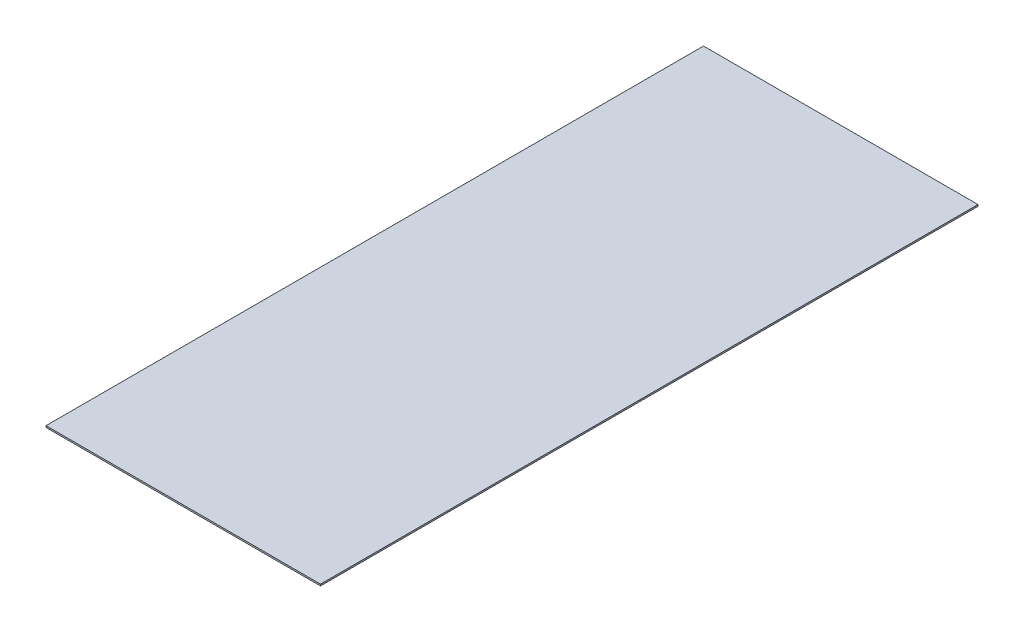
ISO-10303-21;
HEADER;
FILE_DESCRIPTION(('STEP AP214'),'2;1');
FILE_NAME('part.step','',(''),(''),'','','');
FILE_SCHEMA(('AUTOMOTIVE_DESIGN { 1 0 10303 214 1 1 1 1 }'));
ENDSEC;
DATA;
#1=APPLICATION_CONTEXT('core data for automotive mechanical design processes');
#2=APPLICATION_PROTOCOL_DEFINITION('international standard','automotive_design',2000,#1);
#3=PRODUCT_CONTEXT('',#1,'mechanical');
#4=PRODUCT('Part','Part','',(#3));
#5=PRODUCT_RELATED_PRODUCT_CATEGORY('part','',(#4));
#6=PRODUCT_DEFINITION_FORMATION('','',#4);
#7=PRODUCT_DEFINITION_CONTEXT('part definition',#1,'design');
#8=PRODUCT_DEFINITION('design','',#6,#7);
#9=PRODUCT_DEFINITION_SHAPE('','',#8);
#10=(LENGTH_UNIT() NAMED_UNIT(*) SI_UNIT(.MILLI.,.METRE.));
#11=(NAMED_UNIT(*) PLANE_ANGLE_UNIT() SI_UNIT($,.RADIAN.));
#12=(NAMED_UNIT(*) SI_UNIT($,.STERADIAN.) SOLID_ANGLE_UNIT());
#13=UNCERTAINTY_MEASURE_WITH_UNIT(LENGTH_MEASURE(1.E-05),#10,'distance_accuracy_value','');
#14=(GEOMETRIC_REPRESENTATION_CONTEXT(3) GLOBAL_UNCERTAINTY_ASSIGNED_CONTEXT((#13)) GLOBAL_UNIT_ASSIGNED_CONTEXT((#10,
#11,#12)) REPRESENTATION_CONTEXT('',''));
#15=CARTESIAN_POINT('',(0.,0.,0.));
#16=DIRECTION('',(0.,0.,1.));
#17=DIRECTION('',(1.,0.,0.));
#18=AXIS2_PLACEMENT_3D('',#15,#16,#17);
#19=CARTESIAN_POINT('',(546.1,6.35,1308.1));
#20=DIRECTION('',(-1.,0.,0.));
#21=DIRECTION('',(0.,0.,1.));
#22=AXIS2_PLACEMENT_3D('',#19,#20,#21);
#23=PLANE('',#22);
#24=DIRECTION('',(0.,0.,-1.));
#25=VECTOR('',#24,1.);
#26=CARTESIAN_POINT('',(546.1,0.,1308.1));
#27=LINE('',#26,#25);
#28=CARTESIAN_POINT('',(546.1,0.,1308.1));
#29=VERTEX_POINT('',#28);
#30=CARTESIAN_POINT('',(546.1,0.,-1308.1));
#31=VERTEX_POINT('',#30);
#32=EDGE_CURVE('E96',#29,#31,#27,.T.);
#33=ORIENTED_EDGE('',*,*,#32,.T.);
#34=DIRECTION('',(0.,-1.,0.));
#35=VECTOR('',#34,1.);
#36=CARTESIAN_POINT('',(546.1,6.35,-1308.1));
#37=LINE('',#36,#35);
#38=CARTESIAN_POINT('',(546.1,6.35,-1308.1));
#39=VERTEX_POINT('',#38);
#40=EDGE_CURVE('E11',#39,#31,#37,.T.);
#41=ORIENTED_EDGE('',*,*,#40,.F.);
#42=DIRECTION('',(0.,0.,-1.));
#43=VECTOR('',#42,1.);
#44=CARTESIAN_POINT('',(546.1,6.35,1308.1));
#45=LINE('',#44,#43);
#46=CARTESIAN_POINT('',(546.1,6.35,1308.1));
#47=VERTEX_POINT('',#46);
#48=EDGE_CURVE('E84',#47,#39,#45,.T.);
#49=ORIENTED_EDGE('',*,*,#48,.F.);
#50=DIRECTION('',(0.,-1.,0.));
#51=VECTOR('',#50,1.);
#52=CARTESIAN_POINT('',(546.1,6.35,1308.1));
#53=LINE('',#52,#51);
#54=EDGE_CURVE('E92',#47,#29,#53,.T.);
#55=ORIENTED_EDGE('',*,*,#54,.T.);
#56=EDGE_LOOP('',(#33,#41,#49,#55));
#57=FACE_BOUND('',#56,.T.);
#58=ADVANCED_FACE('F33',(#57),#23,.F.);
#59=CARTESIAN_POINT('',(-546.1,6.35,-1308.1));
#60=DIRECTION('',(0.,0.,1.));
#61=DIRECTION('',(1.,0.,0.));
#62=AXIS2_PLACEMENT_3D('',#59,#60,#61);
#63=PLANE('',#62);
#64=DIRECTION('',(-1.,0.,0.));
#65=VECTOR('',#64,1.);
#66=CARTESIAN_POINT('',(-546.1,0.,-1308.1));
#67=LINE('',#66,#65);
#68=CARTESIAN_POINT('',(-546.1,0.,-1308.1));
#69=VERTEX_POINT('',#68);
#70=EDGE_CURVE('E88',#31,#69,#67,.T.);
#71=ORIENTED_EDGE('',*,*,#70,.T.);
#72=DIRECTION('',(0.,-1.,0.));
#73=VECTOR('',#72,1.);
#74=CARTESIAN_POINT('',(-546.1,6.35,-1308.1));
#75=LINE('',#74,#73);
#76=CARTESIAN_POINT('',(-546.1,6.35,-1308.1));
#77=VERTEX_POINT('',#76);
#78=EDGE_CURVE('E41',#77,#69,#75,.T.);
#79=ORIENTED_EDGE('',*,*,#78,.F.);
#80=DIRECTION('',(-1.,0.,0.));
#81=VECTOR('',#80,1.);
#82=CARTESIAN_POINT('',(-546.1,6.35,-1308.1));
#83=LINE('',#82,#81);
#84=EDGE_CURVE('E79',#39,#77,#83,.T.);
#85=ORIENTED_EDGE('',*,*,#84,.F.);
#86=ORIENTED_EDGE('',*,*,#40,.T.);
#87=EDGE_LOOP('',(#71,#79,#85,#86));
#88=FACE_BOUND('',#87,.T.);
#89=ADVANCED_FACE('F87',(#88),#63,.F.);
#90=CARTESIAN_POINT('',(-546.1,6.35,1308.1));
#91=DIRECTION('',(1.,0.,0.));
#92=DIRECTION('',(0.,0.,-1.));
#93=AXIS2_PLACEMENT_3D('',#90,#91,#92);
#94=PLANE('',#93);
#95=DIRECTION('',(0.,0.,1.));
#96=VECTOR('',#95,1.);
#97=CARTESIAN_POINT('',(-546.1,0.,1308.1));
#98=LINE('',#97,#96);
#99=CARTESIAN_POINT('',(-546.1,0.,1308.1));
#100=VERTEX_POINT('',#99);
#101=EDGE_CURVE('E66',#69,#100,#98,.T.);
#102=ORIENTED_EDGE('',*,*,#101,.T.);
#103=DIRECTION('',(0.,-1.,0.));
#104=VECTOR('',#103,1.);
#105=CARTESIAN_POINT('',(-546.1,6.35,1308.1));
#106=LINE('',#105,#104);
#107=CARTESIAN_POINT('',(-546.1,6.35,1308.1));
#108=VERTEX_POINT('',#107);
#109=EDGE_CURVE('E89',#108,#100,#106,.T.);
#110=ORIENTED_EDGE('',*,*,#109,.F.);
#111=DIRECTION('',(0.,0.,1.));
#112=VECTOR('',#111,1.);
#113=CARTESIAN_POINT('',(-546.1,6.35,1308.1));
#114=LINE('',#113,#112);
#115=EDGE_CURVE('E82',#77,#108,#114,.T.);
#116=ORIENTED_EDGE('',*,*,#115,.F.);
#117=ORIENTED_EDGE('',*,*,#78,.T.);
#118=EDGE_LOOP('',(#102,#110,#116,#117));
#119=FACE_BOUND('',#118,.T.);
#120=ADVANCED_FACE('F90',(#119),#94,.F.);
#121=CARTESIAN_POINT('',(-546.1,6.35,1308.1));
#122=DIRECTION('',(0.,0.,-1.));
#123=DIRECTION('',(-1.,0.,0.));
#124=AXIS2_PLACEMENT_3D('',#121,#122,#123);
#125=PLANE('',#124);
#126=DIRECTION('',(1.,0.,0.));
#127=VECTOR('',#126,1.);
#128=CARTESIAN_POINT('',(-546.1,0.,1308.1));
#129=LINE('',#128,#127);
#130=EDGE_CURVE('E72',#100,#29,#129,.T.);
#131=ORIENTED_EDGE('',*,*,#130,.T.);
#132=ORIENTED_EDGE('',*,*,#54,.F.);
#133=DIRECTION('',(1.,0.,0.));
#134=VECTOR('',#133,1.);
#135=CARTESIAN_POINT('',(-546.1,6.35,1308.1));
#136=LINE('',#135,#134);
#137=EDGE_CURVE('E49',#108,#47,#136,.T.);
#138=ORIENTED_EDGE('',*,*,#137,.F.);
#139=ORIENTED_EDGE('',*,*,#109,.T.);
#140=EDGE_LOOP('',(#131,#132,#138,#139));
#141=FACE_BOUND('',#140,.T.);
#142=ADVANCED_FACE('F103',(#141),#125,.F.);
#143=CARTESIAN_POINT('',(0.,6.35,0.));
#144=DIRECTION('',(0.,-1.,0.));
#145=DIRECTION('',(0.,0.,-1.));
#146=AXIS2_PLACEMENT_3D('',#143,#144,#145);
#147=PLANE('',#146);
#148=ORIENTED_EDGE('',*,*,#48,.T.);
#149=ORIENTED_EDGE('',*,*,#84,.T.);
#150=ORIENTED_EDGE('',*,*,#115,.T.);
#151=ORIENTED_EDGE('',*,*,#137,.T.);
#152=EDGE_LOOP('',(#148,#149,#150,#151));
#153=FACE_BOUND('',#152,.T.);
#154=ADVANCED_FACE('F80',(#153),#147,.F.);
#155=CARTESIAN_POINT('',(0.,0.,0.));
#156=DIRECTION('',(0.,-1.,0.));
#157=DIRECTION('',(0.,0.,-1.));
#158=AXIS2_PLACEMENT_3D('',#155,#156,#157);
#159=PLANE('',#158);
#160=ORIENTED_EDGE('',*,*,#32,.F.);
#161=ORIENTED_EDGE('',*,*,#130,.F.);
#162=ORIENTED_EDGE('',*,*,#101,.F.);
#163=ORIENTED_EDGE('',*,*,#70,.F.);
#164=EDGE_LOOP('',(#160,#161,#162,#163));
#165=FACE_BOUND('',#164,.T.);
#166=ADVANCED_FACE('F106',(#165),#159,.T.);
#167=CLOSED_SHELL('',(#58,#89,#120,#142,#154,#166));
#168=MANIFOLD_SOLID_BREP('B2',#167);
#169=ADVANCED_BREP_SHAPE_REPRESENTATION('',(#18,#168),#14);
#170=SHAPE_DEFINITION_REPRESENTATION(#9,#169);
ENDSEC;
END-ISO-10303-21;
